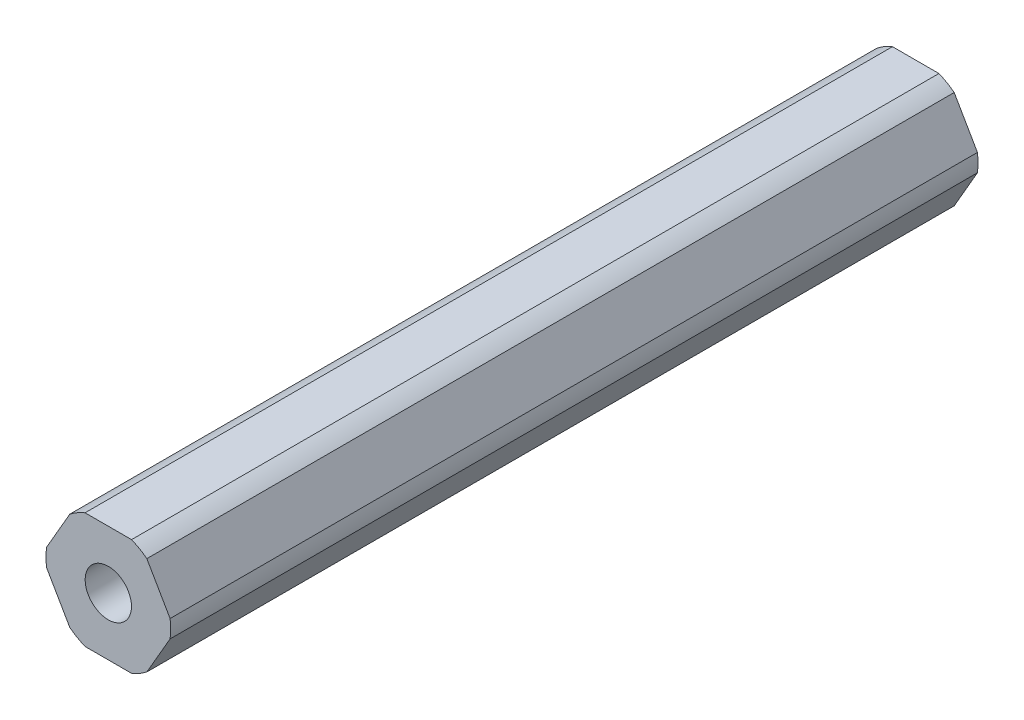
ISO-10303-21;
HEADER;
FILE_DESCRIPTION(('STEP AP214'),'2;1');
FILE_NAME('part.step','',(''),(''),'','','');
FILE_SCHEMA(('AUTOMOTIVE_DESIGN { 1 0 10303 214 1 1 1 1 }'));
ENDSEC;
DATA;
#1=APPLICATION_CONTEXT('core data for automotive mechanical design processes');
#2=APPLICATION_PROTOCOL_DEFINITION('international standard','automotive_design',2000,#1);
#3=PRODUCT_CONTEXT('',#1,'mechanical');
#4=PRODUCT('Part','Part','',(#3));
#5=PRODUCT_RELATED_PRODUCT_CATEGORY('part','',(#4));
#6=PRODUCT_DEFINITION_FORMATION('','',#4);
#7=PRODUCT_DEFINITION_CONTEXT('part definition',#1,'design');
#8=PRODUCT_DEFINITION('design','',#6,#7);
#9=PRODUCT_DEFINITION_SHAPE('','',#8);
#10=(LENGTH_UNIT() NAMED_UNIT(*) SI_UNIT(.MILLI.,.METRE.));
#11=(NAMED_UNIT(*) PLANE_ANGLE_UNIT() SI_UNIT($,.RADIAN.));
#12=(NAMED_UNIT(*) SI_UNIT($,.STERADIAN.) SOLID_ANGLE_UNIT());
#13=UNCERTAINTY_MEASURE_WITH_UNIT(LENGTH_MEASURE(1.E-05),#10,'distance_accuracy_value','');
#14=(GEOMETRIC_REPRESENTATION_CONTEXT(3) GLOBAL_UNCERTAINTY_ASSIGNED_CONTEXT((#13)) GLOBAL_UNIT_ASSIGNED_CONTEXT((#10,
#11,#12)) REPRESENTATION_CONTEXT('',''));
#15=CARTESIAN_POINT('',(0.,0.,0.));
#16=DIRECTION('',(0.,0.,1.));
#17=DIRECTION('',(1.,0.,0.));
#18=AXIS2_PLACEMENT_3D('',#15,#16,#17);
#19=CARTESIAN_POINT('',(0.,0.,-228.6));
#20=DIRECTION('',(0.,0.,1.));
#21=DIRECTION('',(1.,0.,0.));
#22=AXIS2_PLACEMENT_3D('',#19,#20,#21);
#23=CYLINDRICAL_SURFACE('',#22,6.87);
#24=CARTESIAN_POINT('',(0.,0.,-139.7));
#25=DIRECTION('',(0.,0.,-1.));
#26=DIRECTION('',(-1.,0.,0.));
#27=AXIS2_PLACEMENT_3D('',#24,#25,#26);
#28=CIRCLE('',#27,6.87);
#29=CARTESIAN_POINT('',(6.80102150534208,-0.971085209378953,-139.7));
#30=VERTEX_POINT('',#29);
#31=CARTESIAN_POINT('',(6.80102150534208,0.971085209378946,-139.7));
#32=VERTEX_POINT('',#31);
#33=EDGE_CURVE('E102',#30,#32,#28,.F.);
#34=ORIENTED_EDGE('',*,*,#33,.F.);
#35=DIRECTION('',(0.,0.,1.));
#36=VECTOR('',#35,1.);
#37=CARTESIAN_POINT('',(6.80102150534208,-0.971085209378955,228.6));
#38=LINE('',#37,#36);
#39=CARTESIAN_POINT('',(6.80102150534208,-0.971085209378953,-228.6));
#40=VERTEX_POINT('',#39);
#41=EDGE_CURVE('E97',#30,#40,#38,.F.);
#42=ORIENTED_EDGE('',*,*,#41,.T.);
#43=CARTESIAN_POINT('',(0.,0.,-228.6));
#44=DIRECTION('',(0.,0.,1.));
#45=DIRECTION('',(1.,0.,0.));
#46=AXIS2_PLACEMENT_3D('',#43,#44,#45);
#47=CIRCLE('',#46,6.87);
#48=CARTESIAN_POINT('',(6.80102150534208,0.971085209378948,-228.6));
#49=VERTEX_POINT('',#48);
#50=EDGE_CURVE('E100',#40,#49,#47,.T.);
#51=ORIENTED_EDGE('',*,*,#50,.T.);
#52=DIRECTION('',(0.,0.,1.));
#53=VECTOR('',#52,1.);
#54=CARTESIAN_POINT('',(6.80102150534208,0.97108520937895,228.6));
#55=LINE('',#54,#53);
#56=EDGE_CURVE('E145',#49,#32,#55,.T.);
#57=ORIENTED_EDGE('',*,*,#56,.T.);
#58=EDGE_LOOP('',(#34,#42,#51,#57));
#59=FACE_BOUND('',#58,.T.);
#60=ADVANCED_FACE('F34',(#59),#23,.T.);
#61=CARTESIAN_POINT('',(3.68083890619154,6.3754,228.6));
#62=DIRECTION('',(0.,-1.,0.));
#63=DIRECTION('',(1.,0.,0.));
#64=AXIS2_PLACEMENT_3D('',#61,#62,#63);
#65=PLANE('',#64);
#66=DIRECTION('',(0.,0.,1.));
#67=VECTOR('',#66,1.);
#68=CARTESIAN_POINT('',(-2.55952629210953,6.37540000000001,-228.6));
#69=LINE('',#68,#67);
#70=CARTESIAN_POINT('',(-2.55952629210953,6.3754,-139.7));
#71=VERTEX_POINT('',#70);
#72=CARTESIAN_POINT('',(-2.55952629210953,6.37540000000001,-228.6));
#73=VERTEX_POINT('',#72);
#74=EDGE_CURVE('E119',#71,#73,#69,.F.);
#75=ORIENTED_EDGE('',*,*,#74,.F.);
#76=DIRECTION('',(1.,0.,0.));
#77=VECTOR('',#76,1.);
#78=CARTESIAN_POINT('',(3.68083890619154,6.3754,-139.7));
#79=LINE('',#78,#77);
#80=CARTESIAN_POINT('',(2.55952629210953,6.37540000000001,-139.7));
#81=VERTEX_POINT('',#80);
#82=EDGE_CURVE('E186',#71,#81,#79,.T.);
#83=ORIENTED_EDGE('',*,*,#82,.T.);
#84=DIRECTION('',(0.,0.,1.));
#85=VECTOR('',#84,1.);
#86=CARTESIAN_POINT('',(2.55952629210953,6.37540000000001,-228.6));
#87=LINE('',#86,#85);
#88=CARTESIAN_POINT('',(2.55952629210953,6.37540000000001,-228.6));
#89=VERTEX_POINT('',#88);
#90=EDGE_CURVE('E143',#89,#81,#87,.T.);
#91=ORIENTED_EDGE('',*,*,#90,.F.);
#92=DIRECTION('',(1.,0.,0.));
#93=VECTOR('',#92,1.);
#94=CARTESIAN_POINT('',(0.,6.3754,-228.6));
#95=LINE('',#94,#93);
#96=EDGE_CURVE('E140',#89,#73,#95,.F.);
#97=ORIENTED_EDGE('',*,*,#96,.T.);
#98=EDGE_LOOP('',(#75,#83,#91,#97));
#99=FACE_BOUND('',#98,.T.);
#100=ADVANCED_FACE('F181',(#99),#65,.F.);
#101=CARTESIAN_POINT('',(0.,0.,-228.6));
#102=DIRECTION('',(0.,0.,1.));
#103=DIRECTION('',(1.,0.,0.));
#104=AXIS2_PLACEMENT_3D('',#101,#102,#103);
#105=CYLINDRICAL_SURFACE('',#104,6.87);
#106=CARTESIAN_POINT('',(0.,0.,-139.7));
#107=DIRECTION('',(0.,0.,-1.));
#108=DIRECTION('',(-1.,0.,0.));
#109=AXIS2_PLACEMENT_3D('',#106,#107,#108);
#110=CIRCLE('',#109,6.87);
#111=CARTESIAN_POINT('',(-4.24149521323255,5.40431479062104,-139.7));
#112=VERTEX_POINT('',#111);
#113=EDGE_CURVE('E235',#71,#112,#110,.F.);
#114=ORIENTED_EDGE('',*,*,#113,.F.);
#115=ORIENTED_EDGE('',*,*,#74,.T.);
#116=CARTESIAN_POINT('',(0.,0.,-228.6));
#117=DIRECTION('',(0.,0.,1.));
#118=DIRECTION('',(1.,0.,0.));
#119=AXIS2_PLACEMENT_3D('',#116,#117,#118);
#120=CIRCLE('',#119,6.87);
#121=CARTESIAN_POINT('',(-4.24149521323255,5.40431479062105,-228.6));
#122=VERTEX_POINT('',#121);
#123=EDGE_CURVE('E139',#73,#122,#120,.T.);
#124=ORIENTED_EDGE('',*,*,#123,.T.);
#125=DIRECTION('',(0.,0.,1.));
#126=VECTOR('',#125,1.);
#127=CARTESIAN_POINT('',(-4.24149521323255,5.40431479062104,228.6));
#128=LINE('',#127,#126);
#129=EDGE_CURVE('E161',#122,#112,#128,.T.);
#130=ORIENTED_EDGE('',*,*,#129,.T.);
#131=EDGE_LOOP('',(#114,#115,#124,#130));
#132=FACE_BOUND('',#131,.T.);
#133=ADVANCED_FACE('F174',(#132),#105,.T.);
#134=CARTESIAN_POINT('',(-3.68083890619154,6.3754,228.6));
#135=DIRECTION('',(0.866025403784439,-0.5,0.));
#136=DIRECTION('',(0.5,0.866025403784439,0.));
#137=AXIS2_PLACEMENT_3D('',#134,#135,#136);
#138=PLANE('',#137);
#139=DIRECTION('',(0.,0.,1.));
#140=VECTOR('',#139,1.);
#141=CARTESIAN_POINT('',(-6.80102150534208,0.971085209378959,-228.6));
#142=LINE('',#141,#140);
#143=CARTESIAN_POINT('',(-6.80102150534208,0.97108520937896,-139.7));
#144=VERTEX_POINT('',#143);
#145=CARTESIAN_POINT('',(-6.80102150534208,0.971085209378961,-228.6));
#146=VERTEX_POINT('',#145);
#147=EDGE_CURVE('E159',#144,#146,#142,.F.);
#148=ORIENTED_EDGE('',*,*,#147,.F.);
#149=DIRECTION('',(0.5,0.866025403784439,0.));
#150=VECTOR('',#149,1.);
#151=CARTESIAN_POINT('',(-3.68083890619154,6.3754,-139.7));
#152=LINE('',#151,#150);
#153=EDGE_CURVE('E232',#144,#112,#152,.T.);
#154=ORIENTED_EDGE('',*,*,#153,.T.);
#155=ORIENTED_EDGE('',*,*,#129,.F.);
#156=DIRECTION('',(-0.5,-0.866025403784439,0.));
#157=VECTOR('',#156,1.);
#158=CARTESIAN_POINT('',(-4.24149521323255,5.40431479062104,-228.6));
#159=LINE('',#158,#157);
#160=EDGE_CURVE('E136',#122,#146,#159,.T.);
#161=ORIENTED_EDGE('',*,*,#160,.T.);
#162=EDGE_LOOP('',(#148,#154,#155,#161));
#163=FACE_BOUND('',#162,.T.);
#164=ADVANCED_FACE('F260',(#163),#138,.F.);
#165=CARTESIAN_POINT('',(0.,0.,-228.6));
#166=DIRECTION('',(0.,0.,1.));
#167=DIRECTION('',(1.,0.,0.));
#168=AXIS2_PLACEMENT_3D('',#165,#166,#167);
#169=CYLINDRICAL_SURFACE('',#168,6.87);
#170=CARTESIAN_POINT('',(0.,0.,-139.7));
#171=DIRECTION('',(0.,0.,-1.));
#172=DIRECTION('',(-1.,0.,0.));
#173=AXIS2_PLACEMENT_3D('',#170,#171,#172);
#174=CIRCLE('',#173,6.87);
#175=CARTESIAN_POINT('',(-6.80102150534208,-0.971085209378956,-139.7));
#176=VERTEX_POINT('',#175);
#177=EDGE_CURVE('E230',#144,#176,#174,.F.);
#178=ORIENTED_EDGE('',*,*,#177,.F.);
#179=ORIENTED_EDGE('',*,*,#147,.T.);
#180=CARTESIAN_POINT('',(0.,0.,-228.6));
#181=DIRECTION('',(0.,0.,1.));
#182=DIRECTION('',(1.,0.,0.));
#183=AXIS2_PLACEMENT_3D('',#180,#181,#182);
#184=CIRCLE('',#183,6.87);
#185=CARTESIAN_POINT('',(-6.80102150534208,-0.971085209378956,-228.6));
#186=VERTEX_POINT('',#185);
#187=EDGE_CURVE('E135',#146,#186,#184,.T.);
#188=ORIENTED_EDGE('',*,*,#187,.T.);
#189=DIRECTION('',(0.,0.,1.));
#190=VECTOR('',#189,1.);
#191=CARTESIAN_POINT('',(-6.80102150534208,-0.971085209378956,228.6));
#192=LINE('',#191,#190);
#193=EDGE_CURVE('E156',#186,#176,#192,.T.);
#194=ORIENTED_EDGE('',*,*,#193,.T.);
#195=EDGE_LOOP('',(#178,#179,#188,#194));
#196=FACE_BOUND('',#195,.T.);
#197=ADVANCED_FACE('F265',(#196),#169,.T.);
#198=CARTESIAN_POINT('',(-7.36167781238308,0.,228.6));
#199=DIRECTION('',(0.866025403784439,0.5,0.));
#200=DIRECTION('',(-0.5,0.866025403784439,0.));
#201=AXIS2_PLACEMENT_3D('',#198,#199,#200);
#202=PLANE('',#201);
#203=DIRECTION('',(0.,0.,1.));
#204=VECTOR('',#203,1.);
#205=CARTESIAN_POINT('',(-4.24149521323255,-5.40431479062105,-228.6));
#206=LINE('',#205,#204);
#207=CARTESIAN_POINT('',(-4.24149521323254,-5.40431479062105,-139.7));
#208=VERTEX_POINT('',#207);
#209=CARTESIAN_POINT('',(-4.24149521323254,-5.40431479062105,-228.6));
#210=VERTEX_POINT('',#209);
#211=EDGE_CURVE('E154',#208,#210,#206,.F.);
#212=ORIENTED_EDGE('',*,*,#211,.F.);
#213=DIRECTION('',(-0.5,0.866025403784439,0.));
#214=VECTOR('',#213,1.);
#215=CARTESIAN_POINT('',(-7.36167781238308,0.,-139.7));
#216=LINE('',#215,#214);
#217=EDGE_CURVE('E227',#208,#176,#216,.T.);
#218=ORIENTED_EDGE('',*,*,#217,.T.);
#219=ORIENTED_EDGE('',*,*,#193,.F.);
#220=DIRECTION('',(0.5,-0.866025403784438,0.));
#221=VECTOR('',#220,1.);
#222=CARTESIAN_POINT('',(-6.80102150534208,-0.971085209378956,-228.6));
#223=LINE('',#222,#221);
#224=EDGE_CURVE('E132',#186,#210,#223,.T.);
#225=ORIENTED_EDGE('',*,*,#224,.T.);
#226=EDGE_LOOP('',(#212,#218,#219,#225));
#227=FACE_BOUND('',#226,.T.);
#228=ADVANCED_FACE('F269',(#227),#202,.F.);
#229=CARTESIAN_POINT('',(0.,0.,-228.6));
#230=DIRECTION('',(0.,0.,1.));
#231=DIRECTION('',(1.,0.,0.));
#232=AXIS2_PLACEMENT_3D('',#229,#230,#231);
#233=CYLINDRICAL_SURFACE('',#232,6.87);
#234=CARTESIAN_POINT('',(0.,0.,-139.7));
#235=DIRECTION('',(0.,0.,-1.));
#236=DIRECTION('',(-1.,0.,0.));
#237=AXIS2_PLACEMENT_3D('',#234,#235,#236);
#238=CIRCLE('',#237,6.87);
#239=CARTESIAN_POINT('',(-2.55952629210953,-6.3754,-139.7));
#240=VERTEX_POINT('',#239);
#241=EDGE_CURVE('E225',#208,#240,#238,.F.);
#242=ORIENTED_EDGE('',*,*,#241,.F.);
#243=ORIENTED_EDGE('',*,*,#211,.T.);
#244=CARTESIAN_POINT('',(0.,0.,-228.6));
#245=DIRECTION('',(0.,0.,1.));
#246=DIRECTION('',(1.,0.,0.));
#247=AXIS2_PLACEMENT_3D('',#244,#245,#246);
#248=CIRCLE('',#247,6.87);
#249=CARTESIAN_POINT('',(-2.55952629210953,-6.3754,-228.6));
#250=VERTEX_POINT('',#249);
#251=EDGE_CURVE('E131',#210,#250,#248,.T.);
#252=ORIENTED_EDGE('',*,*,#251,.T.);
#253=DIRECTION('',(0.,0.,1.));
#254=VECTOR('',#253,1.);
#255=CARTESIAN_POINT('',(-2.55952629210953,-6.3754,228.6));
#256=LINE('',#255,#254);
#257=EDGE_CURVE('E151',#250,#240,#256,.T.);
#258=ORIENTED_EDGE('',*,*,#257,.T.);
#259=EDGE_LOOP('',(#242,#243,#252,#258));
#260=FACE_BOUND('',#259,.T.);
#261=ADVANCED_FACE('F273',(#260),#233,.T.);
#262=CARTESIAN_POINT('',(-3.68083890619154,-6.3754,228.6));
#263=DIRECTION('',(0.,1.,0.));
#264=DIRECTION('',(0.,0.,1.));
#265=AXIS2_PLACEMENT_3D('',#262,#263,#264);
#266=PLANE('',#265);
#267=DIRECTION('',(0.,0.,1.));
#268=VECTOR('',#267,1.);
#269=CARTESIAN_POINT('',(2.55952629210953,-6.3754,-228.6));
#270=LINE('',#269,#268);
#271=CARTESIAN_POINT('',(2.55952629210953,-6.3754,-139.7));
#272=VERTEX_POINT('',#271);
#273=CARTESIAN_POINT('',(2.55952629210953,-6.3754,-228.6));
#274=VERTEX_POINT('',#273);
#275=EDGE_CURVE('E107',#272,#274,#270,.F.);
#276=ORIENTED_EDGE('',*,*,#275,.F.);
#277=DIRECTION('',(-1.,0.,0.));
#278=VECTOR('',#277,1.);
#279=CARTESIAN_POINT('',(-3.68083890619154,-6.3754,-139.7));
#280=LINE('',#279,#278);
#281=EDGE_CURVE('E220',#272,#240,#280,.T.);
#282=ORIENTED_EDGE('',*,*,#281,.T.);
#283=ORIENTED_EDGE('',*,*,#257,.F.);
#284=DIRECTION('',(1.,0.,0.));
#285=VECTOR('',#284,1.);
#286=CARTESIAN_POINT('',(0.,-6.3754,-228.6));
#287=LINE('',#286,#285);
#288=EDGE_CURVE('E125',#250,#274,#287,.T.);
#289=ORIENTED_EDGE('',*,*,#288,.T.);
#290=EDGE_LOOP('',(#276,#282,#283,#289));
#291=FACE_BOUND('',#290,.T.);
#292=ADVANCED_FACE('F277',(#291),#266,.F.);
#293=CARTESIAN_POINT('',(0.,0.,-228.6));
#294=DIRECTION('',(0.,0.,1.));
#295=DIRECTION('',(1.,0.,0.));
#296=AXIS2_PLACEMENT_3D('',#293,#294,#295);
#297=CYLINDRICAL_SURFACE('',#296,6.87);
#298=CARTESIAN_POINT('',(0.,0.,-139.7));
#299=DIRECTION('',(0.,0.,-1.));
#300=DIRECTION('',(-1.,0.,0.));
#301=AXIS2_PLACEMENT_3D('',#298,#299,#300);
#302=CIRCLE('',#301,6.87);
#303=CARTESIAN_POINT('',(4.24149521323254,-5.40431479062105,-139.7));
#304=VERTEX_POINT('',#303);
#305=EDGE_CURVE('E215',#272,#304,#302,.F.);
#306=ORIENTED_EDGE('',*,*,#305,.F.);
#307=ORIENTED_EDGE('',*,*,#275,.T.);
#308=CARTESIAN_POINT('',(0.,0.,-228.6));
#309=DIRECTION('',(0.,0.,1.));
#310=DIRECTION('',(1.,0.,0.));
#311=AXIS2_PLACEMENT_3D('',#308,#309,#310);
#312=CIRCLE('',#311,6.87);
#313=CARTESIAN_POINT('',(4.24149521323254,-5.40431479062105,-228.6));
#314=VERTEX_POINT('',#313);
#315=EDGE_CURVE('E122',#274,#314,#312,.T.);
#316=ORIENTED_EDGE('',*,*,#315,.T.);
#317=DIRECTION('',(0.,0.,1.));
#318=VECTOR('',#317,1.);
#319=CARTESIAN_POINT('',(4.24149521323254,-5.40431479062105,228.6));
#320=LINE('',#319,#318);
#321=EDGE_CURVE('E106',#314,#304,#320,.T.);
#322=ORIENTED_EDGE('',*,*,#321,.T.);
#323=EDGE_LOOP('',(#306,#307,#316,#322));
#324=FACE_BOUND('',#323,.T.);
#325=ADVANCED_FACE('F281',(#324),#297,.T.);
#326=CARTESIAN_POINT('',(3.68083890619154,-6.3754,228.6));
#327=DIRECTION('',(-0.866025403784439,0.5,0.));
#328=DIRECTION('',(-0.5,-0.866025403784439,0.));
#329=AXIS2_PLACEMENT_3D('',#326,#327,#328);
#330=PLANE('',#329);
#331=ORIENTED_EDGE('',*,*,#41,.F.);
#332=DIRECTION('',(-0.5,-0.866025403784439,0.));
#333=VECTOR('',#332,1.);
#334=CARTESIAN_POINT('',(3.68083890619154,-6.3754,-139.7));
#335=LINE('',#334,#333);
#336=EDGE_CURVE('E216',#30,#304,#335,.T.);
#337=ORIENTED_EDGE('',*,*,#336,.T.);
#338=ORIENTED_EDGE('',*,*,#321,.F.);
#339=DIRECTION('',(0.5,0.866025403784439,0.));
#340=VECTOR('',#339,1.);
#341=CARTESIAN_POINT('',(4.24149521323254,-5.40431479062105,-228.6));
#342=LINE('',#341,#340);
#343=EDGE_CURVE('E115',#314,#40,#342,.T.);
#344=ORIENTED_EDGE('',*,*,#343,.T.);
#345=EDGE_LOOP('',(#331,#337,#338,#344));
#346=FACE_BOUND('',#345,.T.);
#347=ADVANCED_FACE('F120',(#346),#330,.F.);
#348=CARTESIAN_POINT('',(7.36167781238308,0.,228.6));
#349=DIRECTION('',(-0.866025403784439,-0.5,0.));
#350=DIRECTION('',(0.5,-0.866025403784439,0.));
#351=AXIS2_PLACEMENT_3D('',#348,#349,#350);
#352=PLANE('',#351);
#353=DIRECTION('',(0.,0.,1.));
#354=VECTOR('',#353,1.);
#355=CARTESIAN_POINT('',(4.24149521323254,5.40431479062105,-228.6));
#356=LINE('',#355,#354);
#357=CARTESIAN_POINT('',(4.24149521323254,5.40431479062105,-139.7));
#358=VERTEX_POINT('',#357);
#359=CARTESIAN_POINT('',(4.24149521323254,5.40431479062105,-228.6));
#360=VERTEX_POINT('',#359);
#361=EDGE_CURVE('E58',#358,#360,#356,.F.);
#362=ORIENTED_EDGE('',*,*,#361,.F.);
#363=DIRECTION('',(-0.5,0.866025403784439,0.));
#364=VECTOR('',#363,1.);
#365=CARTESIAN_POINT('',(-1.49992059004266,15.3487386692726,-139.7));
#366=LINE('',#365,#364);
#367=EDGE_CURVE('E50',#32,#358,#366,.T.);
#368=ORIENTED_EDGE('',*,*,#367,.F.);
#369=ORIENTED_EDGE('',*,*,#56,.F.);
#370=DIRECTION('',(-0.5,0.866025403784438,0.));
#371=VECTOR('',#370,1.);
#372=CARTESIAN_POINT('',(6.80102150534208,0.97108520937895,-228.6));
#373=LINE('',#372,#371);
#374=EDGE_CURVE('E118',#49,#360,#373,.T.);
#375=ORIENTED_EDGE('',*,*,#374,.T.);
#376=EDGE_LOOP('',(#362,#368,#369,#375));
#377=FACE_BOUND('',#376,.T.);
#378=ADVANCED_FACE('F189',(#377),#352,.F.);
#379=CARTESIAN_POINT('',(0.,0.,-228.6));
#380=DIRECTION('',(0.,0.,1.));
#381=DIRECTION('',(1.,0.,0.));
#382=AXIS2_PLACEMENT_3D('',#379,#380,#381);
#383=CYLINDRICAL_SURFACE('',#382,6.87);
#384=CARTESIAN_POINT('',(0.,0.,-139.7));
#385=DIRECTION('',(0.,0.,-1.));
#386=DIRECTION('',(-1.,0.,0.));
#387=AXIS2_PLACEMENT_3D('',#384,#385,#386);
#388=CIRCLE('',#387,6.87);
#389=EDGE_CURVE('E238',#358,#81,#388,.F.);
#390=ORIENTED_EDGE('',*,*,#389,.F.);
#391=ORIENTED_EDGE('',*,*,#361,.T.);
#392=CARTESIAN_POINT('',(0.,0.,-228.6));
#393=DIRECTION('',(0.,0.,1.));
#394=DIRECTION('',(1.,0.,0.));
#395=AXIS2_PLACEMENT_3D('',#392,#393,#394);
#396=CIRCLE('',#395,6.87);
#397=EDGE_CURVE('E42',#360,#89,#396,.T.);
#398=ORIENTED_EDGE('',*,*,#397,.T.);
#399=ORIENTED_EDGE('',*,*,#90,.T.);
#400=EDGE_LOOP('',(#390,#391,#398,#399));
#401=FACE_BOUND('',#400,.T.);
#402=ADVANCED_FACE('F187',(#401),#383,.T.);
#403=CARTESIAN_POINT('',(0.,0.,-228.6));
#404=DIRECTION('',(0.,0.,1.));
#405=DIRECTION('',(1.,0.,0.));
#406=AXIS2_PLACEMENT_3D('',#403,#404,#405);
#407=PLANE('',#406);
#408=ORIENTED_EDGE('',*,*,#374,.F.);
#409=ORIENTED_EDGE('',*,*,#50,.F.);
#410=ORIENTED_EDGE('',*,*,#343,.F.);
#411=ORIENTED_EDGE('',*,*,#315,.F.);
#412=ORIENTED_EDGE('',*,*,#288,.F.);
#413=ORIENTED_EDGE('',*,*,#251,.F.);
#414=ORIENTED_EDGE('',*,*,#224,.F.);
#415=ORIENTED_EDGE('',*,*,#187,.F.);
#416=ORIENTED_EDGE('',*,*,#160,.F.);
#417=ORIENTED_EDGE('',*,*,#123,.F.);
#418=ORIENTED_EDGE('',*,*,#96,.F.);
#419=ORIENTED_EDGE('',*,*,#397,.F.);
#420=EDGE_LOOP('',(#408,#409,#410,#411,#412,#413,#414,#415,#416,#417,#418,#419));
#421=FACE_BOUND('',#420,.T.);
#422=CARTESIAN_POINT('',(0.,0.,-228.6));
#423=DIRECTION('',(0.,0.,1.));
#424=DIRECTION('',(1.,0.,0.));
#425=AXIS2_PLACEMENT_3D('',#422,#423,#424);
#426=CIRCLE('',#425,2.55);
#427=CARTESIAN_POINT('',(2.55,0.,-228.6));
#428=VERTEX_POINT('',#427);
#429=EDGE_CURVE('E11',#428,#428,#426,.T.);
#430=ORIENTED_EDGE('',*,*,#429,.T.);
#431=EDGE_LOOP('',(#430));
#432=FACE_BOUND('',#431,.T.);
#433=ADVANCED_FACE('F112',(#421,#432),#407,.F.);
#434=CARTESIAN_POINT('',(0.,0.,-228.6));
#435=DIRECTION('',(0.,0.,1.));
#436=DIRECTION('',(1.,0.,0.));
#437=AXIS2_PLACEMENT_3D('',#434,#435,#436);
#438=CYLINDRICAL_SURFACE('',#437,2.55);
#439=CARTESIAN_POINT('',(0.,0.,-139.7));
#440=DIRECTION('',(0.,0.,-1.));
#441=DIRECTION('',(-1.,0.,0.));
#442=AXIS2_PLACEMENT_3D('',#439,#440,#441);
#443=CIRCLE('',#442,2.55);
#444=CARTESIAN_POINT('',(-2.55,0.,-139.7));
#445=VERTEX_POINT('',#444);
#446=EDGE_CURVE('E37',#445,#445,#443,.F.);
#447=ORIENTED_EDGE('',*,*,#446,.T.);
#448=EDGE_LOOP('',(#447));
#449=FACE_BOUND('',#448,.T.);
#450=ORIENTED_EDGE('',*,*,#429,.F.);
#451=EDGE_LOOP('',(#450));
#452=FACE_BOUND('',#451,.T.);
#453=ADVANCED_FACE('F243',(#449,#452),#438,.F.);
#454=CARTESIAN_POINT('',(-89.4881016145416,-35.4512613307274,-139.7));
#455=DIRECTION('',(0.,0.,-1.));
#456=DIRECTION('',(-1.,0.,0.));
#457=AXIS2_PLACEMENT_3D('',#454,#455,#456);
#458=PLANE('',#457);
#459=ORIENTED_EDGE('',*,*,#33,.T.);
#460=ORIENTED_EDGE('',*,*,#367,.T.);
#461=ORIENTED_EDGE('',*,*,#389,.T.);
#462=ORIENTED_EDGE('',*,*,#82,.F.);
#463=ORIENTED_EDGE('',*,*,#113,.T.);
#464=ORIENTED_EDGE('',*,*,#153,.F.);
#465=ORIENTED_EDGE('',*,*,#177,.T.);
#466=ORIENTED_EDGE('',*,*,#217,.F.);
#467=ORIENTED_EDGE('',*,*,#241,.T.);
#468=ORIENTED_EDGE('',*,*,#281,.F.);
#469=ORIENTED_EDGE('',*,*,#305,.T.);
#470=ORIENTED_EDGE('',*,*,#336,.F.);
#471=EDGE_LOOP('',(#459,#460,#461,#462,#463,#464,#465,#466,#467,#468,#469,#470));
#472=FACE_BOUND('',#471,.T.);
#473=ORIENTED_EDGE('',*,*,#446,.F.);
#474=EDGE_LOOP('',(#473));
#475=FACE_BOUND('',#474,.T.);
#476=ADVANCED_FACE('F217',(#472,#475),#458,.F.);
#477=CLOSED_SHELL('',(#60,#100,#133,#164,#197,#228,#261,#292,#325,#347,#378,#402,#433,#453,#476));
#478=MANIFOLD_SOLID_BREP('B2',#477);
#479=ADVANCED_BREP_SHAPE_REPRESENTATION('',(#18,#478),#14);
#480=SHAPE_DEFINITION_REPRESENTATION(#9,#479);
ENDSEC;
END-ISO-10303-21;
